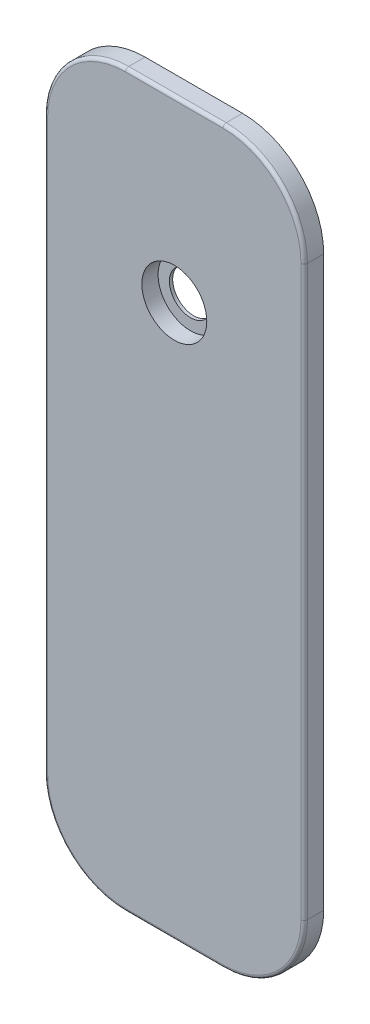
ISO-10303-21;
HEADER;
FILE_DESCRIPTION(('STEP AP214'),'2;1');
FILE_NAME('part.step','',(''),(''),'','','');
FILE_SCHEMA(('AUTOMOTIVE_DESIGN { 1 0 10303 214 1 1 1 1 }'));
ENDSEC;
DATA;
#1=APPLICATION_CONTEXT('core data for automotive mechanical design processes');
#2=APPLICATION_PROTOCOL_DEFINITION('international standard','automotive_design',2000,#1);
#3=PRODUCT_CONTEXT('',#1,'mechanical');
#4=PRODUCT('Part','Part','',(#3));
#5=PRODUCT_RELATED_PRODUCT_CATEGORY('part','',(#4));
#6=PRODUCT_DEFINITION_FORMATION('','',#4);
#7=PRODUCT_DEFINITION_CONTEXT('part definition',#1,'design');
#8=PRODUCT_DEFINITION('design','',#6,#7);
#9=PRODUCT_DEFINITION_SHAPE('','',#8);
#10=(LENGTH_UNIT() NAMED_UNIT(*) SI_UNIT(.MILLI.,.METRE.));
#11=(NAMED_UNIT(*) PLANE_ANGLE_UNIT() SI_UNIT($,.RADIAN.));
#12=(NAMED_UNIT(*) SI_UNIT($,.STERADIAN.) SOLID_ANGLE_UNIT());
#13=UNCERTAINTY_MEASURE_WITH_UNIT(LENGTH_MEASURE(1.E-05),#10,'distance_accuracy_value','');
#14=(GEOMETRIC_REPRESENTATION_CONTEXT(3) GLOBAL_UNCERTAINTY_ASSIGNED_CONTEXT((#13)) GLOBAL_UNIT_ASSIGNED_CONTEXT((#10,
#11,#12)) REPRESENTATION_CONTEXT('',''));
#15=CARTESIAN_POINT('',(0.,0.,0.));
#16=DIRECTION('',(0.,0.,1.));
#17=DIRECTION('',(1.,0.,0.));
#18=AXIS2_PLACEMENT_3D('',#15,#16,#17);
#19=CARTESIAN_POINT('',(0.,57.5,6.));
#20=DIRECTION('',(0.,0.,-1.));
#21=DIRECTION('',(-1.,0.,0.));
#22=AXIS2_PLACEMENT_3D('',#19,#20,#21);
#23=CYLINDRICAL_SURFACE('',#22,6.5);
#24=CARTESIAN_POINT('',(0.,57.5,0.));
#25=DIRECTION('',(0.,0.,1.));
#26=DIRECTION('',(1.,0.,0.));
#27=AXIS2_PLACEMENT_3D('',#24,#25,#26);
#28=CIRCLE('',#27,6.5);
#29=CARTESIAN_POINT('',(6.50000000000001,57.5,0.));
#30=VERTEX_POINT('',#29);
#31=EDGE_CURVE('E154',#30,#30,#28,.T.);
#32=ORIENTED_EDGE('',*,*,#31,.F.);
#33=EDGE_LOOP('',(#32));
#34=FACE_BOUND('',#33,.T.);
#35=CARTESIAN_POINT('',(0.,57.5,1.));
#36=DIRECTION('',(0.,0.,1.));
#37=DIRECTION('',(1.,0.,0.));
#38=AXIS2_PLACEMENT_3D('',#35,#36,#37);
#39=CIRCLE('',#38,6.5);
#40=CARTESIAN_POINT('',(6.50000000000001,57.5,1.));
#41=VERTEX_POINT('',#40);
#42=EDGE_CURVE('E40',#41,#41,#39,.T.);
#43=ORIENTED_EDGE('',*,*,#42,.T.);
#44=EDGE_LOOP('',(#43));
#45=FACE_BOUND('',#44,.T.);
#46=ADVANCED_FACE('F36',(#34,#45),#23,.F.);
#47=CARTESIAN_POINT('',(-15.,-87.5,6.));
#48=DIRECTION('',(0.,0.,-1.));
#49=DIRECTION('',(-1.,0.,0.));
#50=AXIS2_PLACEMENT_3D('',#47,#48,#49);
#51=PLANE('',#50);
#52=CARTESIAN_POINT('',(0.,57.5,6.));
#53=DIRECTION('',(0.,0.,1.));
#54=DIRECTION('',(1.,0.,0.));
#55=AXIS2_PLACEMENT_3D('',#52,#53,#54);
#56=CIRCLE('',#55,10.);
#57=CARTESIAN_POINT('',(10.,57.5,6.));
#58=VERTEX_POINT('',#57);
#59=EDGE_CURVE('E467',#58,#58,#56,.T.);
#60=ORIENTED_EDGE('',*,*,#59,.F.);
#61=EDGE_LOOP('',(#60));
#62=FACE_BOUND('',#61,.T.);
#63=DIRECTION('',(1.,0.,0.));
#64=VECTOR('',#63,1.);
#65=CARTESIAN_POINT('',(-15.,-111.5,6.));
#66=LINE('',#65,#64);
#67=CARTESIAN_POINT('',(-15.,-111.5,6.));
#68=VERTEX_POINT('',#67);
#69=CARTESIAN_POINT('',(15.,-111.5,6.));
#70=VERTEX_POINT('',#69);
#71=EDGE_CURVE('E199',#68,#70,#66,.T.);
#72=ORIENTED_EDGE('',*,*,#71,.T.);
#73=CARTESIAN_POINT('',(15.,-87.5,6.));
#74=DIRECTION('',(0.,0.,-1.));
#75=DIRECTION('',(-1.,0.,0.));
#76=AXIS2_PLACEMENT_3D('',#73,#74,#75);
#77=CIRCLE('',#76,24.);
#78=CARTESIAN_POINT('',(39.,-87.5,6.));
#79=VERTEX_POINT('',#78);
#80=EDGE_CURVE('E201',#70,#79,#77,.F.);
#81=ORIENTED_EDGE('',*,*,#80,.T.);
#82=DIRECTION('',(0.,1.,0.));
#83=VECTOR('',#82,1.);
#84=CARTESIAN_POINT('',(39.,-87.5,6.));
#85=LINE('',#84,#83);
#86=CARTESIAN_POINT('',(39.,87.5,6.));
#87=VERTEX_POINT('',#86);
#88=EDGE_CURVE('E137',#79,#87,#85,.T.);
#89=ORIENTED_EDGE('',*,*,#88,.T.);
#90=CARTESIAN_POINT('',(15.,87.5,6.));
#91=DIRECTION('',(0.,0.,-1.));
#92=DIRECTION('',(-1.,0.,0.));
#93=AXIS2_PLACEMENT_3D('',#90,#91,#92);
#94=CIRCLE('',#93,24.);
#95=CARTESIAN_POINT('',(15.,111.5,6.));
#96=VERTEX_POINT('',#95);
#97=EDGE_CURVE('E189',#87,#96,#94,.F.);
#98=ORIENTED_EDGE('',*,*,#97,.T.);
#99=DIRECTION('',(-1.,0.,0.));
#100=VECTOR('',#99,1.);
#101=CARTESIAN_POINT('',(-15.,111.5,6.));
#102=LINE('',#101,#100);
#103=CARTESIAN_POINT('',(-15.,111.5,6.));
#104=VERTEX_POINT('',#103);
#105=EDGE_CURVE('E191',#96,#104,#102,.T.);
#106=ORIENTED_EDGE('',*,*,#105,.T.);
#107=CARTESIAN_POINT('',(-15.,87.5,6.));
#108=DIRECTION('',(0.,0.,-1.));
#109=DIRECTION('',(-1.,0.,0.));
#110=AXIS2_PLACEMENT_3D('',#107,#108,#109);
#111=CIRCLE('',#110,24.);
#112=CARTESIAN_POINT('',(-39.,87.5,6.));
#113=VERTEX_POINT('',#112);
#114=EDGE_CURVE('E193',#104,#113,#111,.F.);
#115=ORIENTED_EDGE('',*,*,#114,.T.);
#116=DIRECTION('',(0.,-1.,0.));
#117=VECTOR('',#116,1.);
#118=CARTESIAN_POINT('',(-39.,-87.5,6.));
#119=LINE('',#118,#117);
#120=CARTESIAN_POINT('',(-39.,-87.5,6.));
#121=VERTEX_POINT('',#120);
#122=EDGE_CURVE('E195',#113,#121,#119,.T.);
#123=ORIENTED_EDGE('',*,*,#122,.T.);
#124=CARTESIAN_POINT('',(-15.,-87.5,6.));
#125=DIRECTION('',(0.,0.,-1.));
#126=DIRECTION('',(-1.,0.,0.));
#127=AXIS2_PLACEMENT_3D('',#124,#125,#126);
#128=CIRCLE('',#127,24.);
#129=EDGE_CURVE('E197',#121,#68,#128,.F.);
#130=ORIENTED_EDGE('',*,*,#129,.T.);
#131=EDGE_LOOP('',(#72,#81,#89,#98,#106,#115,#123,#130));
#132=FACE_BOUND('',#131,.T.);
#133=ADVANCED_FACE('F263',(#62,#132),#51,.F.);
#134=CARTESIAN_POINT('',(-15.,-87.5,0.));
#135=DIRECTION('',(0.,0.,-1.));
#136=DIRECTION('',(-1.,0.,0.));
#137=AXIS2_PLACEMENT_3D('',#134,#135,#136);
#138=PLANE('',#137);
#139=CARTESIAN_POINT('',(-15.,-87.5,0.));
#140=DIRECTION('',(0.,0.,1.));
#141=DIRECTION('',(-1.,0.,0.));
#142=AXIS2_PLACEMENT_3D('',#139,#140,#141);
#143=CIRCLE('',#142,25.);
#144=CARTESIAN_POINT('',(-40.,-87.5,0.));
#145=VERTEX_POINT('',#144);
#146=CARTESIAN_POINT('',(-15.,-112.5,0.));
#147=VERTEX_POINT('',#146);
#148=EDGE_CURVE('E145',#145,#147,#143,.T.);
#149=ORIENTED_EDGE('',*,*,#148,.F.);
#150=DIRECTION('',(0.,-1.,0.));
#151=VECTOR('',#150,1.);
#152=CARTESIAN_POINT('',(-40.,87.5,0.));
#153=LINE('',#152,#151);
#154=CARTESIAN_POINT('',(-40.,87.5,0.));
#155=VERTEX_POINT('',#154);
#156=EDGE_CURVE('E174',#155,#145,#153,.T.);
#157=ORIENTED_EDGE('',*,*,#156,.F.);
#158=CARTESIAN_POINT('',(-15.,87.5,0.));
#159=DIRECTION('',(0.,0.,1.));
#160=DIRECTION('',(1.,0.,0.));
#161=AXIS2_PLACEMENT_3D('',#158,#159,#160);
#162=CIRCLE('',#161,25.);
#163=CARTESIAN_POINT('',(-15.,112.5,0.));
#164=VERTEX_POINT('',#163);
#165=EDGE_CURVE('E171',#164,#155,#162,.T.);
#166=ORIENTED_EDGE('',*,*,#165,.F.);
#167=DIRECTION('',(-1.,0.,0.));
#168=VECTOR('',#167,1.);
#169=CARTESIAN_POINT('',(15.,112.5,0.));
#170=LINE('',#169,#168);
#171=CARTESIAN_POINT('',(15.,112.5,0.));
#172=VERTEX_POINT('',#171);
#173=EDGE_CURVE('E168',#172,#164,#170,.T.);
#174=ORIENTED_EDGE('',*,*,#173,.F.);
#175=CARTESIAN_POINT('',(15.,87.5,0.));
#176=DIRECTION('',(0.,0.,1.));
#177=DIRECTION('',(-1.,0.,0.));
#178=AXIS2_PLACEMENT_3D('',#175,#176,#177);
#179=CIRCLE('',#178,25.);
#180=CARTESIAN_POINT('',(40.,87.5,0.));
#181=VERTEX_POINT('',#180);
#182=EDGE_CURVE('E165',#181,#172,#179,.T.);
#183=ORIENTED_EDGE('',*,*,#182,.F.);
#184=DIRECTION('',(0.,1.,0.));
#185=VECTOR('',#184,1.);
#186=CARTESIAN_POINT('',(40.,87.5,0.));
#187=LINE('',#186,#185);
#188=CARTESIAN_POINT('',(40.,-87.5,0.));
#189=VERTEX_POINT('',#188);
#190=EDGE_CURVE('E162',#189,#181,#187,.T.);
#191=ORIENTED_EDGE('',*,*,#190,.F.);
#192=CARTESIAN_POINT('',(15.,-87.5,0.));
#193=DIRECTION('',(0.,0.,1.));
#194=DIRECTION('',(-1.,0.,0.));
#195=AXIS2_PLACEMENT_3D('',#192,#193,#194);
#196=CIRCLE('',#195,25.);
#197=CARTESIAN_POINT('',(15.,-112.5,0.));
#198=VERTEX_POINT('',#197);
#199=EDGE_CURVE('E148',#198,#189,#196,.T.);
#200=ORIENTED_EDGE('',*,*,#199,.F.);
#201=DIRECTION('',(1.,0.,0.));
#202=VECTOR('',#201,1.);
#203=CARTESIAN_POINT('',(15.,-112.5,0.));
#204=LINE('',#203,#202);
#205=EDGE_CURVE('E130',#147,#198,#204,.T.);
#206=ORIENTED_EDGE('',*,*,#205,.F.);
#207=EDGE_LOOP('',(#149,#157,#166,#174,#183,#191,#200,#206));
#208=FACE_BOUND('',#207,.T.);
#209=ORIENTED_EDGE('',*,*,#31,.T.);
#210=EDGE_LOOP('',(#209));
#211=FACE_BOUND('',#210,.T.);
#212=ADVANCED_FACE('F142',(#208,#211),#138,.T.);
#213=CARTESIAN_POINT('',(-15.,-87.5,6.));
#214=DIRECTION('',(0.,0.,-1.));
#215=DIRECTION('',(-1.,0.,0.));
#216=AXIS2_PLACEMENT_3D('',#213,#214,#215);
#217=CYLINDRICAL_SURFACE('',#216,25.);
#218=DIRECTION('',(0.,0.,-1.));
#219=VECTOR('',#218,1.);
#220=CARTESIAN_POINT('',(-15.,-112.5,6.));
#221=LINE('',#220,#219);
#222=CARTESIAN_POINT('',(-15.,-112.5,5.));
#223=VERTEX_POINT('',#222);
#224=EDGE_CURVE('E126',#223,#147,#221,.T.);
#225=ORIENTED_EDGE('',*,*,#224,.F.);
#226=CARTESIAN_POINT('',(-15.,-87.5,5.));
#227=DIRECTION('',(0.,0.,-1.));
#228=DIRECTION('',(-1.,0.,0.));
#229=AXIS2_PLACEMENT_3D('',#226,#227,#228);
#230=CIRCLE('',#229,25.);
#231=CARTESIAN_POINT('',(-40.,-87.5,5.));
#232=VERTEX_POINT('',#231);
#233=EDGE_CURVE('E208',#223,#232,#230,.T.);
#234=ORIENTED_EDGE('',*,*,#233,.T.);
#235=DIRECTION('',(0.,0.,-1.));
#236=VECTOR('',#235,1.);
#237=CARTESIAN_POINT('',(-40.,-87.5,6.));
#238=LINE('',#237,#236);
#239=EDGE_CURVE('E152',#232,#145,#238,.T.);
#240=ORIENTED_EDGE('',*,*,#239,.T.);
#241=ORIENTED_EDGE('',*,*,#148,.T.);
#242=EDGE_LOOP('',(#225,#234,#240,#241));
#243=FACE_BOUND('',#242,.T.);
#244=ADVANCED_FACE('F150',(#243),#217,.T.);
#245=CARTESIAN_POINT('',(15.,-112.5,6.));
#246=DIRECTION('',(0.,1.,0.));
#247=DIRECTION('',(0.,0.,1.));
#248=AXIS2_PLACEMENT_3D('',#245,#246,#247);
#249=PLANE('',#248);
#250=DIRECTION('',(0.,0.,-1.));
#251=VECTOR('',#250,1.);
#252=CARTESIAN_POINT('',(15.,-112.5,6.));
#253=LINE('',#252,#251);
#254=CARTESIAN_POINT('',(15.,-112.5,5.));
#255=VERTEX_POINT('',#254);
#256=EDGE_CURVE('E138',#255,#198,#253,.T.);
#257=ORIENTED_EDGE('',*,*,#256,.F.);
#258=DIRECTION('',(1.,0.,0.));
#259=VECTOR('',#258,1.);
#260=CARTESIAN_POINT('',(15.,-112.5,5.));
#261=LINE('',#260,#259);
#262=EDGE_CURVE('E133',#255,#223,#261,.F.);
#263=ORIENTED_EDGE('',*,*,#262,.T.);
#264=ORIENTED_EDGE('',*,*,#224,.T.);
#265=ORIENTED_EDGE('',*,*,#205,.T.);
#266=EDGE_LOOP('',(#257,#263,#264,#265));
#267=FACE_BOUND('',#266,.T.);
#268=ADVANCED_FACE('F129',(#267),#249,.F.);
#269=CARTESIAN_POINT('',(15.,-87.5,6.));
#270=DIRECTION('',(0.,0.,-1.));
#271=DIRECTION('',(-1.,0.,0.));
#272=AXIS2_PLACEMENT_3D('',#269,#270,#271);
#273=CYLINDRICAL_SURFACE('',#272,25.);
#274=DIRECTION('',(0.,0.,-1.));
#275=VECTOR('',#274,1.);
#276=CARTESIAN_POINT('',(40.,-87.5,6.));
#277=LINE('',#276,#275);
#278=CARTESIAN_POINT('',(40.,-87.5,5.));
#279=VERTEX_POINT('',#278);
#280=EDGE_CURVE('E185',#279,#189,#277,.T.);
#281=ORIENTED_EDGE('',*,*,#280,.F.);
#282=CARTESIAN_POINT('',(15.,-87.5,5.));
#283=DIRECTION('',(0.,0.,-1.));
#284=DIRECTION('',(-1.,0.,0.));
#285=AXIS2_PLACEMENT_3D('',#282,#283,#284);
#286=CIRCLE('',#285,25.);
#287=EDGE_CURVE('E204',#279,#255,#286,.T.);
#288=ORIENTED_EDGE('',*,*,#287,.T.);
#289=ORIENTED_EDGE('',*,*,#256,.T.);
#290=ORIENTED_EDGE('',*,*,#199,.T.);
#291=EDGE_LOOP('',(#281,#288,#289,#290));
#292=FACE_BOUND('',#291,.T.);
#293=ADVANCED_FACE('F284',(#292),#273,.T.);
#294=CARTESIAN_POINT('',(40.,87.5,6.));
#295=DIRECTION('',(-1.,0.,0.));
#296=DIRECTION('',(0.,0.,1.));
#297=AXIS2_PLACEMENT_3D('',#294,#295,#296);
#298=PLANE('',#297);
#299=DIRECTION('',(0.,0.,-1.));
#300=VECTOR('',#299,1.);
#301=CARTESIAN_POINT('',(40.,87.5,6.));
#302=LINE('',#301,#300);
#303=CARTESIAN_POINT('',(40.,87.5,5.));
#304=VERTEX_POINT('',#303);
#305=EDGE_CURVE('E183',#304,#181,#302,.T.);
#306=ORIENTED_EDGE('',*,*,#305,.F.);
#307=DIRECTION('',(0.,1.,0.));
#308=VECTOR('',#307,1.);
#309=CARTESIAN_POINT('',(40.,87.5,5.));
#310=LINE('',#309,#308);
#311=EDGE_CURVE('E11',#304,#279,#310,.F.);
#312=ORIENTED_EDGE('',*,*,#311,.T.);
#313=ORIENTED_EDGE('',*,*,#280,.T.);
#314=ORIENTED_EDGE('',*,*,#190,.T.);
#315=EDGE_LOOP('',(#306,#312,#313,#314));
#316=FACE_BOUND('',#315,.T.);
#317=ADVANCED_FACE('F405',(#316),#298,.F.);
#318=CARTESIAN_POINT('',(15.,87.5,6.));
#319=DIRECTION('',(0.,0.,-1.));
#320=DIRECTION('',(-1.,0.,0.));
#321=AXIS2_PLACEMENT_3D('',#318,#319,#320);
#322=CYLINDRICAL_SURFACE('',#321,25.);
#323=DIRECTION('',(0.,0.,-1.));
#324=VECTOR('',#323,1.);
#325=CARTESIAN_POINT('',(15.,112.5,6.));
#326=LINE('',#325,#324);
#327=CARTESIAN_POINT('',(15.,112.5,5.));
#328=VERTEX_POINT('',#327);
#329=EDGE_CURVE('E181',#328,#172,#326,.T.);
#330=ORIENTED_EDGE('',*,*,#329,.F.);
#331=CARTESIAN_POINT('',(15.,87.5,5.));
#332=DIRECTION('',(0.,0.,-1.));
#333=DIRECTION('',(-1.,0.,0.));
#334=AXIS2_PLACEMENT_3D('',#331,#332,#333);
#335=CIRCLE('',#334,25.);
#336=EDGE_CURVE('E45',#328,#304,#335,.T.);
#337=ORIENTED_EDGE('',*,*,#336,.T.);
#338=ORIENTED_EDGE('',*,*,#305,.T.);
#339=ORIENTED_EDGE('',*,*,#182,.T.);
#340=EDGE_LOOP('',(#330,#337,#338,#339));
#341=FACE_BOUND('',#340,.T.);
#342=ADVANCED_FACE('F397',(#341),#322,.T.);
#343=CARTESIAN_POINT('',(15.,112.5,6.));
#344=DIRECTION('',(0.,-1.,0.));
#345=DIRECTION('',(0.,0.,-1.));
#346=AXIS2_PLACEMENT_3D('',#343,#344,#345);
#347=PLANE('',#346);
#348=DIRECTION('',(0.,0.,-1.));
#349=VECTOR('',#348,1.);
#350=CARTESIAN_POINT('',(-15.,112.5,6.));
#351=LINE('',#350,#349);
#352=CARTESIAN_POINT('',(-15.,112.5,5.));
#353=VERTEX_POINT('',#352);
#354=EDGE_CURVE('E179',#353,#164,#351,.T.);
#355=ORIENTED_EDGE('',*,*,#354,.F.);
#356=DIRECTION('',(-1.,0.,0.));
#357=VECTOR('',#356,1.);
#358=CARTESIAN_POINT('',(15.,112.5,5.));
#359=LINE('',#358,#357);
#360=EDGE_CURVE('E60',#353,#328,#359,.F.);
#361=ORIENTED_EDGE('',*,*,#360,.T.);
#362=ORIENTED_EDGE('',*,*,#329,.T.);
#363=ORIENTED_EDGE('',*,*,#173,.T.);
#364=EDGE_LOOP('',(#355,#361,#362,#363));
#365=FACE_BOUND('',#364,.T.);
#366=ADVANCED_FACE('F248',(#365),#347,.F.);
#367=CARTESIAN_POINT('',(-15.,87.5,6.));
#368=DIRECTION('',(0.,0.,-1.));
#369=DIRECTION('',(-1.,0.,0.));
#370=AXIS2_PLACEMENT_3D('',#367,#368,#369);
#371=CYLINDRICAL_SURFACE('',#370,25.);
#372=DIRECTION('',(0.,0.,-1.));
#373=VECTOR('',#372,1.);
#374=CARTESIAN_POINT('',(-40.,87.5,6.));
#375=LINE('',#374,#373);
#376=CARTESIAN_POINT('',(-40.,87.5,5.));
#377=VERTEX_POINT('',#376);
#378=EDGE_CURVE('E177',#377,#155,#375,.T.);
#379=ORIENTED_EDGE('',*,*,#378,.F.);
#380=CARTESIAN_POINT('',(-15.,87.5,5.));
#381=DIRECTION('',(0.,0.,-1.));
#382=DIRECTION('',(-1.,0.,0.));
#383=AXIS2_PLACEMENT_3D('',#380,#381,#382);
#384=CIRCLE('',#383,25.);
#385=EDGE_CURVE('E212',#377,#353,#384,.T.);
#386=ORIENTED_EDGE('',*,*,#385,.T.);
#387=ORIENTED_EDGE('',*,*,#354,.T.);
#388=ORIENTED_EDGE('',*,*,#165,.T.);
#389=EDGE_LOOP('',(#379,#386,#387,#388));
#390=FACE_BOUND('',#389,.T.);
#391=ADVANCED_FACE('F247',(#390),#371,.T.);
#392=CARTESIAN_POINT('',(-40.,87.5,6.));
#393=DIRECTION('',(1.,0.,0.));
#394=DIRECTION('',(0.,0.,-1.));
#395=AXIS2_PLACEMENT_3D('',#392,#393,#394);
#396=PLANE('',#395);
#397=ORIENTED_EDGE('',*,*,#239,.F.);
#398=DIRECTION('',(0.,-1.,0.));
#399=VECTOR('',#398,1.);
#400=CARTESIAN_POINT('',(-40.,87.5,5.));
#401=LINE('',#400,#399);
#402=EDGE_CURVE('E210',#232,#377,#401,.F.);
#403=ORIENTED_EDGE('',*,*,#402,.T.);
#404=ORIENTED_EDGE('',*,*,#378,.T.);
#405=ORIENTED_EDGE('',*,*,#156,.T.);
#406=EDGE_LOOP('',(#397,#403,#404,#405));
#407=FACE_BOUND('',#406,.T.);
#408=ADVANCED_FACE('F253',(#407),#396,.F.);
#409=CARTESIAN_POINT('',(-15.,87.5,5.));
#410=DIRECTION('',(0.,0.,-1.));
#411=DIRECTION('',(-1.,0.,0.));
#412=AXIS2_PLACEMENT_3D('',#409,#410,#411);
#413=TOROIDAL_SURFACE('',#412,24.,1.);
#414=CARTESIAN_POINT('',(-15.,111.5,5.));
#415=DIRECTION('',(1.,0.,0.));
#416=DIRECTION('',(0.,0.,-1.));
#417=AXIS2_PLACEMENT_3D('',#414,#415,#416);
#418=CIRCLE('',#417,1.);
#419=EDGE_CURVE('E232',#353,#104,#418,.T.);
#420=ORIENTED_EDGE('',*,*,#419,.F.);
#421=ORIENTED_EDGE('',*,*,#385,.F.);
#422=CARTESIAN_POINT('',(-39.,87.5,5.));
#423=DIRECTION('',(0.,-1.,0.));
#424=DIRECTION('',(0.,0.,-1.));
#425=AXIS2_PLACEMENT_3D('',#422,#423,#424);
#426=CIRCLE('',#425,1.);
#427=EDGE_CURVE('E157',#113,#377,#426,.T.);
#428=ORIENTED_EDGE('',*,*,#427,.F.);
#429=ORIENTED_EDGE('',*,*,#114,.F.);
#430=EDGE_LOOP('',(#420,#421,#428,#429));
#431=FACE_BOUND('',#430,.T.);
#432=ADVANCED_FACE('F38',(#431),#413,.T.);
#433=CARTESIAN_POINT('',(-39.,-87.5,5.));
#434=DIRECTION('',(0.,-1.,0.));
#435=DIRECTION('',(0.,0.,-1.));
#436=AXIS2_PLACEMENT_3D('',#433,#434,#435);
#437=CYLINDRICAL_SURFACE('',#436,1.);
#438=ORIENTED_EDGE('',*,*,#427,.T.);
#439=ORIENTED_EDGE('',*,*,#402,.F.);
#440=CARTESIAN_POINT('',(-39.,-87.5,5.));
#441=DIRECTION('',(0.,-1.,0.));
#442=DIRECTION('',(0.,0.,-1.));
#443=AXIS2_PLACEMENT_3D('',#440,#441,#442);
#444=CIRCLE('',#443,1.);
#445=EDGE_CURVE('E229',#121,#232,#444,.T.);
#446=ORIENTED_EDGE('',*,*,#445,.F.);
#447=ORIENTED_EDGE('',*,*,#122,.F.);
#448=EDGE_LOOP('',(#438,#439,#446,#447));
#449=FACE_BOUND('',#448,.T.);
#450=ADVANCED_FACE('F239',(#449),#437,.T.);
#451=CARTESIAN_POINT('',(-15.,111.5,5.));
#452=DIRECTION('',(-1.,0.,0.));
#453=DIRECTION('',(0.,0.,1.));
#454=AXIS2_PLACEMENT_3D('',#451,#452,#453);
#455=CYLINDRICAL_SURFACE('',#454,1.);
#456=ORIENTED_EDGE('',*,*,#419,.T.);
#457=ORIENTED_EDGE('',*,*,#105,.F.);
#458=CARTESIAN_POINT('',(15.,111.5,5.));
#459=DIRECTION('',(1.,0.,0.));
#460=DIRECTION('',(0.,0.,-1.));
#461=AXIS2_PLACEMENT_3D('',#458,#459,#460);
#462=CIRCLE('',#461,1.);
#463=EDGE_CURVE('E226',#328,#96,#462,.T.);
#464=ORIENTED_EDGE('',*,*,#463,.F.);
#465=ORIENTED_EDGE('',*,*,#360,.F.);
#466=EDGE_LOOP('',(#456,#457,#464,#465));
#467=FACE_BOUND('',#466,.T.);
#468=ADVANCED_FACE('F307',(#467),#455,.T.);
#469=CARTESIAN_POINT('',(-15.,-87.5,5.));
#470=DIRECTION('',(0.,0.,-1.));
#471=DIRECTION('',(-1.,0.,0.));
#472=AXIS2_PLACEMENT_3D('',#469,#470,#471);
#473=TOROIDAL_SURFACE('',#472,24.,1.);
#474=ORIENTED_EDGE('',*,*,#445,.T.);
#475=ORIENTED_EDGE('',*,*,#233,.F.);
#476=CARTESIAN_POINT('',(-15.,-111.5,5.));
#477=DIRECTION('',(1.,0.,0.));
#478=DIRECTION('',(0.,0.,-1.));
#479=AXIS2_PLACEMENT_3D('',#476,#477,#478);
#480=CIRCLE('',#479,1.);
#481=EDGE_CURVE('E223',#68,#223,#480,.T.);
#482=ORIENTED_EDGE('',*,*,#481,.F.);
#483=ORIENTED_EDGE('',*,*,#129,.F.);
#484=EDGE_LOOP('',(#474,#475,#482,#483));
#485=FACE_BOUND('',#484,.T.);
#486=ADVANCED_FACE('F303',(#485),#473,.T.);
#487=CARTESIAN_POINT('',(15.,87.5,5.));
#488=DIRECTION('',(0.,0.,-1.));
#489=DIRECTION('',(-1.,0.,0.));
#490=AXIS2_PLACEMENT_3D('',#487,#488,#489);
#491=TOROIDAL_SURFACE('',#490,24.,1.);
#492=ORIENTED_EDGE('',*,*,#463,.T.);
#493=ORIENTED_EDGE('',*,*,#97,.F.);
#494=CARTESIAN_POINT('',(39.,87.5,5.));
#495=DIRECTION('',(0.,-1.,0.));
#496=DIRECTION('',(0.,0.,-1.));
#497=AXIS2_PLACEMENT_3D('',#494,#495,#496);
#498=CIRCLE('',#497,1.);
#499=EDGE_CURVE('E220',#304,#87,#498,.T.);
#500=ORIENTED_EDGE('',*,*,#499,.F.);
#501=ORIENTED_EDGE('',*,*,#336,.F.);
#502=EDGE_LOOP('',(#492,#493,#500,#501));
#503=FACE_BOUND('',#502,.T.);
#504=ADVANCED_FACE('F299',(#503),#491,.T.);
#505=CARTESIAN_POINT('',(-15.,-111.5,5.));
#506=DIRECTION('',(1.,0.,0.));
#507=DIRECTION('',(0.,0.,-1.));
#508=AXIS2_PLACEMENT_3D('',#505,#506,#507);
#509=CYLINDRICAL_SURFACE('',#508,1.);
#510=ORIENTED_EDGE('',*,*,#481,.T.);
#511=ORIENTED_EDGE('',*,*,#262,.F.);
#512=CARTESIAN_POINT('',(15.,-111.5,5.));
#513=DIRECTION('',(1.,0.,0.));
#514=DIRECTION('',(0.,0.,-1.));
#515=AXIS2_PLACEMENT_3D('',#512,#513,#514);
#516=CIRCLE('',#515,1.);
#517=EDGE_CURVE('E218',#70,#255,#516,.T.);
#518=ORIENTED_EDGE('',*,*,#517,.F.);
#519=ORIENTED_EDGE('',*,*,#71,.F.);
#520=EDGE_LOOP('',(#510,#511,#518,#519));
#521=FACE_BOUND('',#520,.T.);
#522=ADVANCED_FACE('F295',(#521),#509,.T.);
#523=CARTESIAN_POINT('',(39.,-87.5,5.));
#524=DIRECTION('',(0.,1.,0.));
#525=DIRECTION('',(0.,0.,1.));
#526=AXIS2_PLACEMENT_3D('',#523,#524,#525);
#527=CYLINDRICAL_SURFACE('',#526,1.);
#528=ORIENTED_EDGE('',*,*,#499,.T.);
#529=ORIENTED_EDGE('',*,*,#88,.F.);
#530=CARTESIAN_POINT('',(39.,-87.5,5.));
#531=DIRECTION('',(0.,-1.,0.));
#532=DIRECTION('',(0.,0.,-1.));
#533=AXIS2_PLACEMENT_3D('',#530,#531,#532);
#534=CIRCLE('',#533,1.);
#535=EDGE_CURVE('E216',#279,#79,#534,.T.);
#536=ORIENTED_EDGE('',*,*,#535,.F.);
#537=ORIENTED_EDGE('',*,*,#311,.F.);
#538=EDGE_LOOP('',(#528,#529,#536,#537));
#539=FACE_BOUND('',#538,.T.);
#540=ADVANCED_FACE('F291',(#539),#527,.T.);
#541=CARTESIAN_POINT('',(15.,-87.5,5.));
#542=DIRECTION('',(0.,0.,-1.));
#543=DIRECTION('',(-1.,0.,0.));
#544=AXIS2_PLACEMENT_3D('',#541,#542,#543);
#545=TOROIDAL_SURFACE('',#544,24.,1.);
#546=ORIENTED_EDGE('',*,*,#517,.T.);
#547=ORIENTED_EDGE('',*,*,#287,.F.);
#548=ORIENTED_EDGE('',*,*,#535,.T.);
#549=ORIENTED_EDGE('',*,*,#80,.F.);
#550=EDGE_LOOP('',(#546,#547,#548,#549));
#551=FACE_BOUND('',#550,.T.);
#552=ADVANCED_FACE('F288',(#551),#545,.T.);
#553=CARTESIAN_POINT('',(0.,57.5,1.));
#554=DIRECTION('',(0.,0.,1.));
#555=DIRECTION('',(1.,0.,0.));
#556=AXIS2_PLACEMENT_3D('',#553,#554,#555);
#557=CYLINDRICAL_SURFACE('',#556,10.);
#558=CARTESIAN_POINT('',(0.,57.5,1.));
#559=DIRECTION('',(0.,0.,1.));
#560=DIRECTION('',(1.,0.,0.));
#561=AXIS2_PLACEMENT_3D('',#558,#559,#560);
#562=CIRCLE('',#561,10.);
#563=CARTESIAN_POINT('',(10.,57.5,1.));
#564=VERTEX_POINT('',#563);
#565=EDGE_CURVE('E466',#564,#564,#562,.T.);
#566=ORIENTED_EDGE('',*,*,#565,.F.);
#567=EDGE_LOOP('',(#566));
#568=FACE_BOUND('',#567,.T.);
#569=ORIENTED_EDGE('',*,*,#59,.T.);
#570=EDGE_LOOP('',(#569));
#571=FACE_BOUND('',#570,.T.);
#572=ADVANCED_FACE('F274',(#568,#571),#557,.F.);
#573=CARTESIAN_POINT('',(0.,57.5,1.));
#574=DIRECTION('',(0.,0.,1.));
#575=DIRECTION('',(1.,0.,0.));
#576=AXIS2_PLACEMENT_3D('',#573,#574,#575);
#577=PLANE('',#576);
#578=ORIENTED_EDGE('',*,*,#42,.F.);
#579=EDGE_LOOP('',(#578));
#580=FACE_BOUND('',#579,.T.);
#581=ORIENTED_EDGE('',*,*,#565,.T.);
#582=EDGE_LOOP('',(#581));
#583=FACE_BOUND('',#582,.T.);
#584=ADVANCED_FACE('F346',(#580,#583),#577,.T.);
#585=CLOSED_SHELL('',(#46,#133,#212,#244,#268,#293,#317,#342,#366,#391,#408,#432,#450,#468,#486,
#504,#522,#540,#552,#572,#584));
#586=MANIFOLD_SOLID_BREP('B2',#585);
#587=ADVANCED_BREP_SHAPE_REPRESENTATION('',(#18,#586),#14);
#588=SHAPE_DEFINITION_REPRESENTATION(#9,#587);
ENDSEC;
END-ISO-10303-21;
